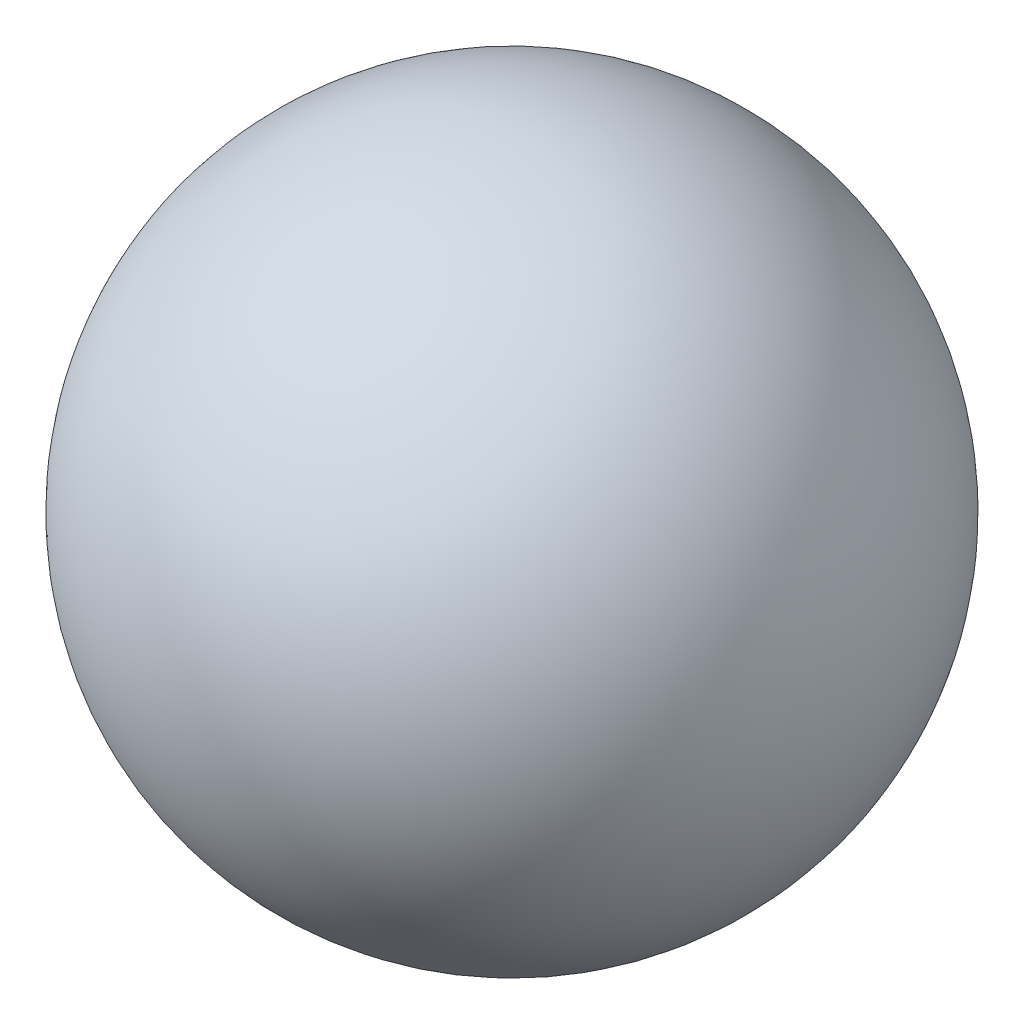
ISO-10303-21;
HEADER;
FILE_DESCRIPTION(('STEP AP214'),'2;1');
FILE_NAME('part.step','',(''),(''),'','','');
FILE_SCHEMA(('AUTOMOTIVE_DESIGN { 1 0 10303 214 1 1 1 1 }'));
ENDSEC;
DATA;
#1=APPLICATION_CONTEXT('core data for automotive mechanical design processes');
#2=APPLICATION_PROTOCOL_DEFINITION('international standard','automotive_design',2000,#1);
#3=PRODUCT_CONTEXT('',#1,'mechanical');
#4=PRODUCT('Part','Part','',(#3));
#5=PRODUCT_RELATED_PRODUCT_CATEGORY('part','',(#4));
#6=PRODUCT_DEFINITION_FORMATION('','',#4);
#7=PRODUCT_DEFINITION_CONTEXT('part definition',#1,'design');
#8=PRODUCT_DEFINITION('design','',#6,#7);
#9=PRODUCT_DEFINITION_SHAPE('','',#8);
#10=(LENGTH_UNIT() NAMED_UNIT(*) SI_UNIT(.MILLI.,.METRE.));
#11=(NAMED_UNIT(*) PLANE_ANGLE_UNIT() SI_UNIT($,.RADIAN.));
#12=(NAMED_UNIT(*) SI_UNIT($,.STERADIAN.) SOLID_ANGLE_UNIT());
#13=UNCERTAINTY_MEASURE_WITH_UNIT(LENGTH_MEASURE(1.E-05),#10,'distance_accuracy_value','');
#14=(GEOMETRIC_REPRESENTATION_CONTEXT(3) GLOBAL_UNCERTAINTY_ASSIGNED_CONTEXT((#13)) GLOBAL_UNIT_ASSIGNED_CONTEXT((#10,
#11,#12)) REPRESENTATION_CONTEXT('',''));
#15=CARTESIAN_POINT('',(0.,0.,0.));
#16=DIRECTION('',(0.,0.,1.));
#17=DIRECTION('',(1.,0.,0.));
#18=AXIS2_PLACEMENT_3D('',#15,#16,#17);
#19=CARTESIAN_POINT('',(0.,0.,0.));
#20=DIRECTION('',(-1.,0.,0.));
#21=DIRECTION('',(0.,1.,0.));
#22=AXIS2_PLACEMENT_3D('',#19,#20,#21);
#23=SPHERICAL_SURFACE('',#22,12.);
#24=CARTESIAN_POINT('',(-12.,0.,0.));
#25=VERTEX_POINT('',#24);
#26=VERTEX_LOOP('',#25);
#27=FACE_BOUND('',#26,.T.);
#28=ADVANCED_FACE('F29',(#27),#23,.T.);
#29=CLOSED_SHELL('',(#28));
#30=MANIFOLD_SOLID_BREP('B2',#29);
#31=ADVANCED_BREP_SHAPE_REPRESENTATION('',(#18,#30),#14);
#32=SHAPE_DEFINITION_REPRESENTATION(#9,#31);
ENDSEC;
END-ISO-10303-21;
